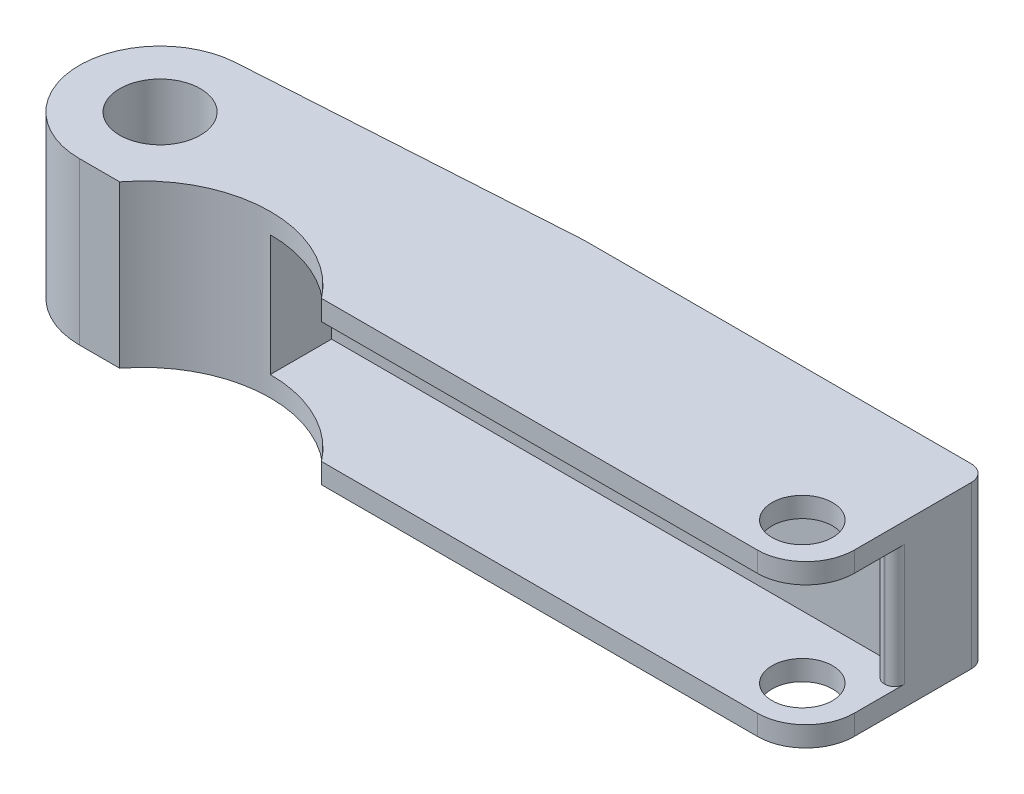
ISO-10303-21;
HEADER;
FILE_DESCRIPTION(('STEP AP214'),'2;1');
FILE_NAME('part.step','',(''),(''),'','','');
FILE_SCHEMA(('AUTOMOTIVE_DESIGN { 1 0 10303 214 1 1 1 1 }'));
ENDSEC;
DATA;
#1=APPLICATION_CONTEXT('core data for automotive mechanical design processes');
#2=APPLICATION_PROTOCOL_DEFINITION('international standard','automotive_design',2000,#1);
#3=PRODUCT_CONTEXT('',#1,'mechanical');
#4=PRODUCT('Part','Part','',(#3));
#5=PRODUCT_RELATED_PRODUCT_CATEGORY('part','',(#4));
#6=PRODUCT_DEFINITION_FORMATION('','',#4);
#7=PRODUCT_DEFINITION_CONTEXT('part definition',#1,'design');
#8=PRODUCT_DEFINITION('design','',#6,#7);
#9=PRODUCT_DEFINITION_SHAPE('','',#8);
#10=(LENGTH_UNIT() NAMED_UNIT(*) SI_UNIT(.MILLI.,.METRE.));
#11=(NAMED_UNIT(*) PLANE_ANGLE_UNIT() SI_UNIT($,.RADIAN.));
#12=(NAMED_UNIT(*) SI_UNIT($,.STERADIAN.) SOLID_ANGLE_UNIT());
#13=UNCERTAINTY_MEASURE_WITH_UNIT(LENGTH_MEASURE(1.E-05),#10,'distance_accuracy_value','');
#14=(GEOMETRIC_REPRESENTATION_CONTEXT(3) GLOBAL_UNCERTAINTY_ASSIGNED_CONTEXT((#13)) GLOBAL_UNIT_ASSIGNED_CONTEXT((#10,
#11,#12)) REPRESENTATION_CONTEXT('',''));
#15=CARTESIAN_POINT('',(0.,0.,0.));
#16=DIRECTION('',(0.,0.,1.));
#17=DIRECTION('',(1.,0.,0.));
#18=AXIS2_PLACEMENT_3D('',#15,#16,#17);
#19=CARTESIAN_POINT('',(127.,25.4,0.));
#20=DIRECTION('',(-1.,0.,0.));
#21=DIRECTION('',(0.,0.,1.));
#22=AXIS2_PLACEMENT_3D('',#19,#20,#21);
#23=PLANE('',#22);
#24=DIRECTION('',(0.,0.,-1.));
#25=VECTOR('',#24,1.);
#26=CARTESIAN_POINT('',(127.,0.,0.));
#27=LINE('',#26,#25);
#28=CARTESIAN_POINT('',(127.,0.,-7.62));
#29=VERTEX_POINT('',#28);
#30=CARTESIAN_POINT('',(127.,0.,-26.035));
#31=VERTEX_POINT('',#30);
#32=EDGE_CURVE('E261',#29,#31,#27,.T.);
#33=ORIENTED_EDGE('',*,*,#32,.T.);
#34=DIRECTION('',(0.,-1.,0.));
#35=VECTOR('',#34,1.);
#36=CARTESIAN_POINT('',(127.,25.4,-26.035));
#37=LINE('',#36,#35);
#38=CARTESIAN_POINT('',(127.,25.4,-26.035));
#39=VERTEX_POINT('',#38);
#40=EDGE_CURVE('E42',#31,#39,#37,.F.);
#41=ORIENTED_EDGE('',*,*,#40,.T.);
#42=DIRECTION('',(0.,0.,-1.));
#43=VECTOR('',#42,1.);
#44=CARTESIAN_POINT('',(127.,25.4,0.));
#45=LINE('',#44,#43);
#46=CARTESIAN_POINT('',(127.,25.4,-7.62));
#47=VERTEX_POINT('',#46);
#48=EDGE_CURVE('E323',#47,#39,#45,.T.);
#49=ORIENTED_EDGE('',*,*,#48,.F.);
#50=DIRECTION('',(0.,-1.,0.));
#51=VECTOR('',#50,1.);
#52=CARTESIAN_POINT('',(127.,25.4,-7.62));
#53=LINE('',#52,#51);
#54=CARTESIAN_POINT('',(127.,22.225,-7.62));
#55=VERTEX_POINT('',#54);
#56=EDGE_CURVE('E196',#47,#55,#53,.T.);
#57=ORIENTED_EDGE('',*,*,#56,.T.);
#58=DIRECTION('',(0.,0.,-1.));
#59=VECTOR('',#58,1.);
#60=CARTESIAN_POINT('',(127.,22.225,0.));
#61=LINE('',#60,#59);
#62=CARTESIAN_POINT('',(127.,22.225,-15.494));
#63=VERTEX_POINT('',#62);
#64=EDGE_CURVE('E192',#55,#63,#61,.T.);
#65=ORIENTED_EDGE('',*,*,#64,.T.);
#66=DIRECTION('',(0.,1.,0.));
#67=VECTOR('',#66,1.);
#68=CARTESIAN_POINT('',(127.,25.4,-15.494));
#69=LINE('',#68,#67);
#70=CARTESIAN_POINT('',(127.,3.175,-15.494));
#71=VERTEX_POINT('',#70);
#72=EDGE_CURVE('E189',#63,#71,#69,.F.);
#73=ORIENTED_EDGE('',*,*,#72,.T.);
#74=DIRECTION('',(0.,0.,-1.));
#75=VECTOR('',#74,1.);
#76=CARTESIAN_POINT('',(127.,3.175,0.));
#77=LINE('',#76,#75);
#78=CARTESIAN_POINT('',(127.,3.175,-7.62));
#79=VERTEX_POINT('',#78);
#80=EDGE_CURVE('E176',#79,#71,#77,.T.);
#81=ORIENTED_EDGE('',*,*,#80,.F.);
#82=EDGE_CURVE('E186',#79,#29,#53,.T.);
#83=ORIENTED_EDGE('',*,*,#82,.T.);
#84=EDGE_LOOP('',(#33,#41,#49,#57,#65,#73,#81,#83));
#85=FACE_BOUND('',#84,.T.);
#86=ADVANCED_FACE('F34',(#85),#23,.F.);
#87=CARTESIAN_POINT('',(119.38,25.4,-7.62));
#88=DIRECTION('',(0.,-1.,0.));
#89=DIRECTION('',(0.,0.,-1.));
#90=AXIS2_PLACEMENT_3D('',#87,#88,#89);
#91=CYLINDRICAL_SURFACE('',#90,7.62);
#92=CARTESIAN_POINT('',(119.38,22.225,-7.62));
#93=DIRECTION('',(0.,1.,0.));
#94=DIRECTION('',(-1.,0.,0.));
#95=AXIS2_PLACEMENT_3D('',#92,#93,#94);
#96=CIRCLE('',#95,7.62);
#97=CARTESIAN_POINT('',(119.38,22.225,0.));
#98=VERTEX_POINT('',#97);
#99=EDGE_CURVE('E183',#55,#98,#96,.F.);
#100=ORIENTED_EDGE('',*,*,#99,.F.);
#101=ORIENTED_EDGE('',*,*,#56,.F.);
#102=CARTESIAN_POINT('',(119.38,25.4,-7.62));
#103=DIRECTION('',(0.,-1.,0.));
#104=DIRECTION('',(0.,0.,-1.));
#105=AXIS2_PLACEMENT_3D('',#102,#103,#104);
#106=CIRCLE('',#105,7.62);
#107=CARTESIAN_POINT('',(119.38,25.4,0.));
#108=VERTEX_POINT('',#107);
#109=EDGE_CURVE('E209',#108,#47,#106,.F.);
#110=ORIENTED_EDGE('',*,*,#109,.F.);
#111=DIRECTION('',(0.,-1.,0.));
#112=VECTOR('',#111,1.);
#113=CARTESIAN_POINT('',(119.38,25.4,0.));
#114=LINE('',#113,#112);
#115=EDGE_CURVE('E205',#98,#108,#114,.F.);
#116=ORIENTED_EDGE('',*,*,#115,.F.);
#117=EDGE_LOOP('',(#100,#101,#110,#116));
#118=FACE_BOUND('',#117,.T.);
#119=ADVANCED_FACE('F335',(#118),#91,.T.);
#120=CARTESIAN_POINT('',(0.,25.4,0.));
#121=DIRECTION('',(0.,0.,-1.));
#122=DIRECTION('',(-1.,0.,0.));
#123=AXIS2_PLACEMENT_3D('',#120,#121,#122);
#124=PLANE('',#123);
#125=DIRECTION('',(1.,0.,0.));
#126=VECTOR('',#125,1.);
#127=CARTESIAN_POINT('',(0.,0.,0.));
#128=LINE('',#127,#126);
#129=CARTESIAN_POINT('',(50.8,0.,0.));
#130=VERTEX_POINT('',#129);
#131=CARTESIAN_POINT('',(119.38,0.,0.));
#132=VERTEX_POINT('',#131);
#133=EDGE_CURVE('E316',#130,#132,#128,.T.);
#134=ORIENTED_EDGE('',*,*,#133,.T.);
#135=DIRECTION('',(0.,-1.,0.));
#136=VECTOR('',#135,1.);
#137=CARTESIAN_POINT('',(119.38,25.4,0.));
#138=LINE('',#137,#136);
#139=CARTESIAN_POINT('',(119.38,3.175,0.));
#140=VERTEX_POINT('',#139);
#141=EDGE_CURVE('E184',#132,#140,#138,.F.);
#142=ORIENTED_EDGE('',*,*,#141,.T.);
#143=DIRECTION('',(1.,0.,0.));
#144=VECTOR('',#143,1.);
#145=CARTESIAN_POINT('',(123.825,3.175,0.));
#146=LINE('',#145,#144);
#147=CARTESIAN_POINT('',(50.8,3.17499999999999,0.));
#148=VERTEX_POINT('',#147);
#149=EDGE_CURVE('E179',#148,#140,#146,.T.);
#150=ORIENTED_EDGE('',*,*,#149,.F.);
#151=DIRECTION('',(0.,1.,0.));
#152=VECTOR('',#151,1.);
#153=CARTESIAN_POINT('',(50.8,-30.48,0.));
#154=LINE('',#153,#152);
#155=EDGE_CURVE('E307',#130,#148,#154,.T.);
#156=ORIENTED_EDGE('',*,*,#155,.F.);
#157=EDGE_LOOP('',(#134,#142,#150,#156));
#158=FACE_BOUND('',#157,.T.);
#159=ADVANCED_FACE('F327',(#158),#124,.F.);
#160=CARTESIAN_POINT('',(0.,25.4,0.));
#161=DIRECTION('',(0.,-1.,0.));
#162=DIRECTION('',(0.,0.,-1.));
#163=AXIS2_PLACEMENT_3D('',#160,#161,#162);
#164=PLANE('',#163);
#165=CARTESIAN_POINT('',(118.82060280476,25.4,-7.62));
#166=DIRECTION('',(0.,-1.,0.));
#167=DIRECTION('',(0.,0.,-1.));
#168=AXIS2_PLACEMENT_3D('',#165,#166,#167);
#169=CIRCLE('',#168,4.7625);
#170=CARTESIAN_POINT('',(118.82060280476,25.4,-12.3825));
#171=VERTEX_POINT('',#170);
#172=EDGE_CURVE('E353',#171,#171,#169,.T.);
#173=ORIENTED_EDGE('',*,*,#172,.T.);
#174=EDGE_LOOP('',(#173));
#175=FACE_BOUND('',#174,.T.);
#176=CARTESIAN_POINT('',(12.7,25.4,-12.7));
#177=DIRECTION('',(0.,1.,0.));
#178=DIRECTION('',(0.,0.,1.));
#179=AXIS2_PLACEMENT_3D('',#176,#177,#178);
#180=CIRCLE('',#179,6.35);
#181=CARTESIAN_POINT('',(12.7,25.4,-6.35));
#182=VERTEX_POINT('',#181);
#183=EDGE_CURVE('E285',#182,#182,#180,.T.);
#184=ORIENTED_EDGE('',*,*,#183,.F.);
#185=EDGE_LOOP('',(#184));
#186=FACE_BOUND('',#185,.T.);
#187=ORIENTED_EDGE('',*,*,#48,.T.);
#188=CARTESIAN_POINT('',(124.46,25.4,-26.035));
#189=DIRECTION('',(0.,-1.,0.));
#190=DIRECTION('',(0.,0.,-1.));
#191=AXIS2_PLACEMENT_3D('',#188,#189,#190);
#192=CIRCLE('',#191,2.54);
#193=CARTESIAN_POINT('',(124.46,25.4,-28.575));
#194=VERTEX_POINT('',#193);
#195=EDGE_CURVE('E12',#39,#194,#192,.F.);
#196=ORIENTED_EDGE('',*,*,#195,.T.);
#197=DIRECTION('',(-1.,0.,0.));
#198=VECTOR('',#197,1.);
#199=CARTESIAN_POINT('',(0.,25.4,-28.575));
#200=LINE('',#199,#198);
#201=CARTESIAN_POINT('',(63.5,25.4,-28.575));
#202=VERTEX_POINT('',#201);
#203=EDGE_CURVE('E253',#194,#202,#200,.T.);
#204=ORIENTED_EDGE('',*,*,#203,.T.);
#205=DIRECTION('',(-0.998082311521692,0.,0.0619007223505286));
#206=VECTOR('',#205,1.);
#207=CARTESIAN_POINT('',(-1.52210819493791,25.4,-24.5423511697803));
#208=LINE('',#207,#206);
#209=CARTESIAN_POINT('',(11.9138608261483,25.4,-25.3756453563255));
#210=VERTEX_POINT('',#209);
#211=EDGE_CURVE('E366',#202,#210,#208,.T.);
#212=ORIENTED_EDGE('',*,*,#211,.T.);
#213=CARTESIAN_POINT('',(12.7,25.4,-12.7));
#214=DIRECTION('',(0.,-1.,0.));
#215=DIRECTION('',(0.,0.,-1.));
#216=AXIS2_PLACEMENT_3D('',#213,#214,#215);
#217=CIRCLE('',#216,12.7);
#218=CARTESIAN_POINT('',(12.7,25.4,0.));
#219=VERTEX_POINT('',#218);
#220=EDGE_CURVE('E278',#210,#219,#217,.F.);
#221=ORIENTED_EDGE('',*,*,#220,.T.);
#222=DIRECTION('',(1.,0.,0.));
#223=VECTOR('',#222,1.);
#224=CARTESIAN_POINT('',(0.,25.4,0.));
#225=LINE('',#224,#223);
#226=CARTESIAN_POINT('',(19.05,25.4,0.));
#227=VERTEX_POINT('',#226);
#228=EDGE_CURVE('E264',#219,#227,#225,.T.);
#229=ORIENTED_EDGE('',*,*,#228,.T.);
#230=CARTESIAN_POINT('',(34.925,25.4,12.2117898343934));
#231=DIRECTION('',(0.,-1.,0.));
#232=DIRECTION('',(0.,0.,-1.));
#233=AXIS2_PLACEMENT_3D('',#230,#231,#232);
#234=CIRCLE('',#233,20.0285654992911);
#235=CARTESIAN_POINT('',(50.8,25.4,0.));
#236=VERTEX_POINT('',#235);
#237=EDGE_CURVE('E312',#236,#227,#234,.F.);
#238=ORIENTED_EDGE('',*,*,#237,.F.);
#239=EDGE_CURVE('E260',#236,#108,#225,.T.);
#240=ORIENTED_EDGE('',*,*,#239,.T.);
#241=ORIENTED_EDGE('',*,*,#109,.T.);
#242=EDGE_LOOP('',(#187,#196,#204,#212,#221,#229,#238,#240,#241));
#243=FACE_BOUND('',#242,.T.);
#244=ADVANCED_FACE('F329',(#175,#186,#243),#164,.F.);
#245=CARTESIAN_POINT('',(0.,0.,0.));
#246=DIRECTION('',(0.,-1.,0.));
#247=DIRECTION('',(0.,0.,-1.));
#248=AXIS2_PLACEMENT_3D('',#245,#246,#247);
#249=PLANE('',#248);
#250=CARTESIAN_POINT('',(118.82060280476,0.,-7.62));
#251=DIRECTION('',(0.,-1.,0.));
#252=DIRECTION('',(0.,0.,-1.));
#253=AXIS2_PLACEMENT_3D('',#250,#251,#252);
#254=CIRCLE('',#253,4.7625);
#255=CARTESIAN_POINT('',(118.82060280476,0.,-12.3825));
#256=VERTEX_POINT('',#255);
#257=EDGE_CURVE('E216',#256,#256,#254,.T.);
#258=ORIENTED_EDGE('',*,*,#257,.F.);
#259=EDGE_LOOP('',(#258));
#260=FACE_BOUND('',#259,.T.);
#261=CARTESIAN_POINT('',(12.7,0.,-12.7));
#262=DIRECTION('',(0.,-1.,0.));
#263=DIRECTION('',(0.,0.,-1.));
#264=AXIS2_PLACEMENT_3D('',#261,#262,#263);
#265=CIRCLE('',#264,6.35);
#266=CARTESIAN_POINT('',(12.7,0.,-19.05));
#267=VERTEX_POINT('',#266);
#268=EDGE_CURVE('E281',#267,#267,#265,.T.);
#269=ORIENTED_EDGE('',*,*,#268,.F.);
#270=EDGE_LOOP('',(#269));
#271=FACE_BOUND('',#270,.T.);
#272=DIRECTION('',(-1.,0.,0.));
#273=VECTOR('',#272,1.);
#274=CARTESIAN_POINT('',(0.,0.,-28.575));
#275=LINE('',#274,#273);
#276=CARTESIAN_POINT('',(124.46,0.,-28.575));
#277=VERTEX_POINT('',#276);
#278=CARTESIAN_POINT('',(63.5,0.,-28.575));
#279=VERTEX_POINT('',#278);
#280=EDGE_CURVE('E251',#277,#279,#275,.T.);
#281=ORIENTED_EDGE('',*,*,#280,.F.);
#282=CARTESIAN_POINT('',(124.46,0.,-26.035));
#283=DIRECTION('',(0.,-1.,0.));
#284=DIRECTION('',(0.,0.,-1.));
#285=AXIS2_PLACEMENT_3D('',#282,#283,#284);
#286=CIRCLE('',#285,2.54);
#287=EDGE_CURVE('E56',#277,#31,#286,.T.);
#288=ORIENTED_EDGE('',*,*,#287,.T.);
#289=ORIENTED_EDGE('',*,*,#32,.F.);
#290=CARTESIAN_POINT('',(119.38,0.,-7.62));
#291=DIRECTION('',(0.,-1.,0.));
#292=DIRECTION('',(0.,0.,-1.));
#293=AXIS2_PLACEMENT_3D('',#290,#291,#292);
#294=CIRCLE('',#293,7.62);
#295=EDGE_CURVE('E195',#29,#132,#294,.T.);
#296=ORIENTED_EDGE('',*,*,#295,.T.);
#297=ORIENTED_EDGE('',*,*,#133,.F.);
#298=CARTESIAN_POINT('',(34.925,0.,12.2117898343934));
#299=DIRECTION('',(0.,-1.,0.));
#300=DIRECTION('',(0.,0.,-1.));
#301=AXIS2_PLACEMENT_3D('',#298,#299,#300);
#302=CIRCLE('',#301,20.0285654992911);
#303=CARTESIAN_POINT('',(19.05,0.,0.));
#304=VERTEX_POINT('',#303);
#305=EDGE_CURVE('E270',#130,#304,#302,.F.);
#306=ORIENTED_EDGE('',*,*,#305,.T.);
#307=CARTESIAN_POINT('',(12.7,0.,0.));
#308=VERTEX_POINT('',#307);
#309=EDGE_CURVE('E266',#308,#304,#128,.T.);
#310=ORIENTED_EDGE('',*,*,#309,.F.);
#311=CARTESIAN_POINT('',(12.7,0.,-12.7));
#312=DIRECTION('',(0.,-1.,0.));
#313=DIRECTION('',(0.,0.,-1.));
#314=AXIS2_PLACEMENT_3D('',#311,#312,#313);
#315=CIRCLE('',#314,12.7);
#316=CARTESIAN_POINT('',(11.9138608261483,0.,-25.3756453563255));
#317=VERTEX_POINT('',#316);
#318=EDGE_CURVE('E276',#308,#317,#315,.T.);
#319=ORIENTED_EDGE('',*,*,#318,.T.);
#320=DIRECTION('',(0.998082311521692,0.,-0.0619007223505286));
#321=VECTOR('',#320,1.);
#322=CARTESIAN_POINT('',(-1.52210819493791,0.,-24.5423511697803));
#323=LINE('',#322,#321);
#324=EDGE_CURVE('E259',#317,#279,#323,.T.);
#325=ORIENTED_EDGE('',*,*,#324,.T.);
#326=EDGE_LOOP('',(#281,#288,#289,#296,#297,#306,#310,#319,#325));
#327=FACE_BOUND('',#326,.T.);
#328=ADVANCED_FACE('F257',(#260,#271,#327),#249,.T.);
#329=CARTESIAN_POINT('',(0.,25.4,-28.575));
#330=DIRECTION('',(0.,0.,1.));
#331=DIRECTION('',(1.,0.,0.));
#332=AXIS2_PLACEMENT_3D('',#329,#330,#331);
#333=PLANE('',#332);
#334=ORIENTED_EDGE('',*,*,#203,.F.);
#335=DIRECTION('',(0.,-1.,0.));
#336=VECTOR('',#335,1.);
#337=CARTESIAN_POINT('',(124.46,25.4,-28.575));
#338=LINE('',#337,#336);
#339=EDGE_CURVE('E243',#194,#277,#338,.T.);
#340=ORIENTED_EDGE('',*,*,#339,.T.);
#341=ORIENTED_EDGE('',*,*,#280,.T.);
#342=DIRECTION('',(0.,1.,0.));
#343=VECTOR('',#342,1.);
#344=CARTESIAN_POINT('',(63.5,-6.35,-28.575));
#345=LINE('',#344,#343);
#346=EDGE_CURVE('E373',#279,#202,#345,.T.);
#347=ORIENTED_EDGE('',*,*,#346,.T.);
#348=EDGE_LOOP('',(#334,#340,#341,#347));
#349=FACE_BOUND('',#348,.T.);
#350=ADVANCED_FACE('F249',(#349),#333,.F.);
#351=ORIENTED_EDGE('',*,*,#228,.F.);
#352=DIRECTION('',(0.,-1.,0.));
#353=VECTOR('',#352,1.);
#354=CARTESIAN_POINT('',(12.7,25.4,0.));
#355=LINE('',#354,#353);
#356=EDGE_CURVE('E273',#219,#308,#355,.T.);
#357=ORIENTED_EDGE('',*,*,#356,.T.);
#358=ORIENTED_EDGE('',*,*,#309,.T.);
#359=DIRECTION('',(0.,1.,0.));
#360=VECTOR('',#359,1.);
#361=CARTESIAN_POINT('',(19.05,-30.48,0.));
#362=LINE('',#361,#360);
#363=EDGE_CURVE('E284',#304,#227,#362,.T.);
#364=ORIENTED_EDGE('',*,*,#363,.T.);
#365=EDGE_LOOP('',(#351,#357,#358,#364));
#366=FACE_BOUND('',#365,.T.);
#367=ADVANCED_FACE('F392',(#366),#124,.F.);
#368=DIRECTION('',(-1.,0.,0.));
#369=VECTOR('',#368,1.);
#370=CARTESIAN_POINT('',(123.825,22.225,0.));
#371=LINE('',#370,#369);
#372=CARTESIAN_POINT('',(50.8,22.225,0.));
#373=VERTEX_POINT('',#372);
#374=EDGE_CURVE('E356',#98,#373,#371,.T.);
#375=ORIENTED_EDGE('',*,*,#374,.F.);
#376=ORIENTED_EDGE('',*,*,#115,.T.);
#377=ORIENTED_EDGE('',*,*,#239,.F.);
#378=EDGE_CURVE('E313',#373,#236,#154,.T.);
#379=ORIENTED_EDGE('',*,*,#378,.F.);
#380=EDGE_LOOP('',(#375,#376,#377,#379));
#381=FACE_BOUND('',#380,.T.);
#382=ADVANCED_FACE('F391',(#381),#124,.F.);
#383=CARTESIAN_POINT('',(34.925,-30.48,12.2117898343934));
#384=DIRECTION('',(0.,1.,0.));
#385=DIRECTION('',(0.,0.,1.));
#386=AXIS2_PLACEMENT_3D('',#383,#384,#385);
#387=CYLINDRICAL_SURFACE('',#386,20.0285654992911);
#388=CARTESIAN_POINT('',(34.925,3.17499999999998,12.2117898343934));
#389=DIRECTION('',(0.,-1.,0.));
#390=DIRECTION('',(1.,0.,0.));
#391=AXIS2_PLACEMENT_3D('',#388,#389,#390);
#392=CIRCLE('',#391,20.0285654992911);
#393=CARTESIAN_POINT('',(34.925,3.17499999999999,-7.81677566489769));
#394=VERTEX_POINT('',#393);
#395=EDGE_CURVE('E197',#394,#148,#392,.T.);
#396=ORIENTED_EDGE('',*,*,#395,.F.);
#397=DIRECTION('',(0.,1.,0.));
#398=VECTOR('',#397,1.);
#399=CARTESIAN_POINT('',(34.925,-30.48,-7.81677566489769));
#400=LINE('',#399,#398);
#401=CARTESIAN_POINT('',(34.925,22.225,-7.81677566489769));
#402=VERTEX_POINT('',#401);
#403=EDGE_CURVE('E200',#402,#394,#400,.F.);
#404=ORIENTED_EDGE('',*,*,#403,.F.);
#405=CARTESIAN_POINT('',(34.925,22.225,12.2117898343934));
#406=DIRECTION('',(0.,1.,0.));
#407=DIRECTION('',(-1.,0.,0.));
#408=AXIS2_PLACEMENT_3D('',#405,#406,#407);
#409=CIRCLE('',#408,20.0285654992911);
#410=EDGE_CURVE('E280',#373,#402,#409,.T.);
#411=ORIENTED_EDGE('',*,*,#410,.F.);
#412=ORIENTED_EDGE('',*,*,#378,.T.);
#413=ORIENTED_EDGE('',*,*,#237,.T.);
#414=ORIENTED_EDGE('',*,*,#363,.F.);
#415=ORIENTED_EDGE('',*,*,#305,.F.);
#416=ORIENTED_EDGE('',*,*,#155,.T.);
#417=EDGE_LOOP('',(#396,#404,#411,#412,#413,#414,#415,#416));
#418=FACE_BOUND('',#417,.T.);
#419=ADVANCED_FACE('F305',(#418),#387,.F.);
#420=CARTESIAN_POINT('',(12.7,25.4,-12.7));
#421=DIRECTION('',(0.,-1.,0.));
#422=DIRECTION('',(0.,0.,-1.));
#423=AXIS2_PLACEMENT_3D('',#420,#421,#422);
#424=CYLINDRICAL_SURFACE('',#423,12.7);
#425=ORIENTED_EDGE('',*,*,#220,.F.);
#426=DIRECTION('',(0.,1.,0.));
#427=VECTOR('',#426,1.);
#428=CARTESIAN_POINT('',(11.9138608261483,-6.35,-25.3756453563255));
#429=LINE('',#428,#427);
#430=EDGE_CURVE('E372',#317,#210,#429,.T.);
#431=ORIENTED_EDGE('',*,*,#430,.F.);
#432=ORIENTED_EDGE('',*,*,#318,.F.);
#433=ORIENTED_EDGE('',*,*,#356,.F.);
#434=EDGE_LOOP('',(#425,#431,#432,#433));
#435=FACE_BOUND('',#434,.T.);
#436=ADVANCED_FACE('F403',(#435),#424,.T.);
#437=CARTESIAN_POINT('',(12.7,-6.35,-12.7));
#438=DIRECTION('',(0.,1.,0.));
#439=DIRECTION('',(0.,0.,1.));
#440=AXIS2_PLACEMENT_3D('',#437,#438,#439);
#441=CYLINDRICAL_SURFACE('',#440,6.35);
#442=ORIENTED_EDGE('',*,*,#268,.T.);
#443=EDGE_LOOP('',(#442));
#444=FACE_BOUND('',#443,.T.);
#445=ORIENTED_EDGE('',*,*,#183,.T.);
#446=EDGE_LOOP('',(#445));
#447=FACE_BOUND('',#446,.T.);
#448=ADVANCED_FACE('F379',(#444,#447),#441,.F.);
#449=CARTESIAN_POINT('',(-1.52210819493791,-6.35,-24.5423511697803));
#450=DIRECTION('',(-0.0619007223505286,0.,-0.998082311521692));
#451=DIRECTION('',(-0.998082311521692,0.,0.0619007223505286));
#452=AXIS2_PLACEMENT_3D('',#449,#450,#451);
#453=PLANE('',#452);
#454=ORIENTED_EDGE('',*,*,#430,.T.);
#455=ORIENTED_EDGE('',*,*,#211,.F.);
#456=ORIENTED_EDGE('',*,*,#346,.F.);
#457=ORIENTED_EDGE('',*,*,#324,.F.);
#458=EDGE_LOOP('',(#454,#455,#456,#457));
#459=FACE_BOUND('',#458,.T.);
#460=ADVANCED_FACE('F436',(#459),#453,.T.);
#461=CARTESIAN_POINT('',(123.825,22.225,-17.4625));
#462=DIRECTION('',(1.,0.,0.));
#463=DIRECTION('',(0.,0.,-1.));
#464=AXIS2_PLACEMENT_3D('',#461,#462,#463);
#465=PLANE('',#464);
#466=DIRECTION('',(0.,0.,1.));
#467=VECTOR('',#466,1.);
#468=CARTESIAN_POINT('',(123.825,3.175,-17.4625));
#469=LINE('',#468,#467);
#470=CARTESIAN_POINT('',(123.825,3.175,-15.9385));
#471=VERTEX_POINT('',#470);
#472=CARTESIAN_POINT('',(123.825,3.175,-15.494));
#473=VERTEX_POINT('',#472);
#474=EDGE_CURVE('E302',#471,#473,#469,.T.);
#475=ORIENTED_EDGE('',*,*,#474,.T.);
#476=DIRECTION('',(0.,1.,0.));
#477=VECTOR('',#476,1.);
#478=CARTESIAN_POINT('',(123.825,22.225,-15.494));
#479=LINE('',#478,#477);
#480=CARTESIAN_POINT('',(123.825,22.225,-15.494));
#481=VERTEX_POINT('',#480);
#482=EDGE_CURVE('E224',#473,#481,#479,.T.);
#483=ORIENTED_EDGE('',*,*,#482,.T.);
#484=DIRECTION('',(0.,0.,1.));
#485=VECTOR('',#484,1.);
#486=CARTESIAN_POINT('',(123.825,22.225,-17.4625));
#487=LINE('',#486,#485);
#488=CARTESIAN_POINT('',(123.825,22.225,-15.9385));
#489=VERTEX_POINT('',#488);
#490=EDGE_CURVE('E362',#489,#481,#487,.T.);
#491=ORIENTED_EDGE('',*,*,#490,.F.);
#492=DIRECTION('',(0.,1.,0.));
#493=VECTOR('',#492,1.);
#494=CARTESIAN_POINT('',(123.825,3.175,-15.9385));
#495=LINE('',#494,#493);
#496=EDGE_CURVE('E222',#489,#471,#495,.F.);
#497=ORIENTED_EDGE('',*,*,#496,.T.);
#498=EDGE_LOOP('',(#475,#483,#491,#497));
#499=FACE_BOUND('',#498,.T.);
#500=ADVANCED_FACE('F438',(#499),#465,.F.);
#501=CARTESIAN_POINT('',(123.825,3.175,-17.4625));
#502=DIRECTION('',(0.,-1.,0.));
#503=DIRECTION('',(1.,0.,0.));
#504=AXIS2_PLACEMENT_3D('',#501,#502,#503);
#505=PLANE('',#504);
#506=ORIENTED_EDGE('',*,*,#474,.F.);
#507=CARTESIAN_POINT('',(122.301,3.175,-15.9385));
#508=DIRECTION('',(0.,-1.,0.));
#509=DIRECTION('',(1.,0.,0.));
#510=AXIS2_PLACEMENT_3D('',#507,#508,#509);
#511=CIRCLE('',#510,1.524);
#512=CARTESIAN_POINT('',(122.301,3.175,-17.4625));
#513=VERTEX_POINT('',#512);
#514=EDGE_CURVE('E232',#471,#513,#511,.F.);
#515=ORIENTED_EDGE('',*,*,#514,.T.);
#516=DIRECTION('',(1.,0.,0.));
#517=VECTOR('',#516,1.);
#518=CARTESIAN_POINT('',(123.825,3.175,-17.4625));
#519=LINE('',#518,#517);
#520=CARTESIAN_POINT('',(34.925,3.17499999999999,-17.4625));
#521=VERTEX_POINT('',#520);
#522=EDGE_CURVE('E301',#521,#513,#519,.T.);
#523=ORIENTED_EDGE('',*,*,#522,.F.);
#524=DIRECTION('',(0.,0.,1.));
#525=VECTOR('',#524,1.);
#526=CARTESIAN_POINT('',(34.925,3.17499999999999,-17.4625));
#527=LINE('',#526,#525);
#528=EDGE_CURVE('E292',#521,#394,#527,.T.);
#529=ORIENTED_EDGE('',*,*,#528,.T.);
#530=ORIENTED_EDGE('',*,*,#395,.T.);
#531=ORIENTED_EDGE('',*,*,#149,.T.);
#532=CARTESIAN_POINT('',(119.38,3.175,-7.62));
#533=DIRECTION('',(0.,-1.,0.));
#534=DIRECTION('',(1.,0.,0.));
#535=AXIS2_PLACEMENT_3D('',#532,#533,#534);
#536=CIRCLE('',#535,7.62);
#537=EDGE_CURVE('E171',#140,#79,#536,.F.);
#538=ORIENTED_EDGE('',*,*,#537,.T.);
#539=ORIENTED_EDGE('',*,*,#80,.T.);
#540=CARTESIAN_POINT('',(125.476,3.175,-15.494));
#541=DIRECTION('',(0.,-1.,0.));
#542=DIRECTION('',(1.,0.,0.));
#543=AXIS2_PLACEMENT_3D('',#540,#541,#542);
#544=CIRCLE('',#543,1.524);
#545=CARTESIAN_POINT('',(125.476,3.175,-13.97));
#546=VERTEX_POINT('',#545);
#547=EDGE_CURVE('E237',#71,#546,#544,.T.);
#548=ORIENTED_EDGE('',*,*,#547,.T.);
#549=DIRECTION('',(1.,0.,0.));
#550=VECTOR('',#549,1.);
#551=CARTESIAN_POINT('',(118.9355,3.175,-13.97));
#552=LINE('',#551,#550);
#553=CARTESIAN_POINT('',(125.349,3.175,-13.97));
#554=VERTEX_POINT('',#553);
#555=EDGE_CURVE('E191',#554,#546,#552,.T.);
#556=ORIENTED_EDGE('',*,*,#555,.F.);
#557=CARTESIAN_POINT('',(125.349,3.175,-15.494));
#558=DIRECTION('',(0.,-1.,0.));
#559=DIRECTION('',(1.,0.,0.));
#560=AXIS2_PLACEMENT_3D('',#557,#558,#559);
#561=CIRCLE('',#560,1.524);
#562=EDGE_CURVE('E241',#554,#473,#561,.T.);
#563=ORIENTED_EDGE('',*,*,#562,.T.);
#564=EDGE_LOOP('',(#506,#515,#523,#529,#530,#531,#538,#539,#548,#556,#563));
#565=FACE_BOUND('',#564,.T.);
#566=CARTESIAN_POINT('',(118.82060280476,3.175,-7.62));
#567=DIRECTION('',(0.,-1.,0.));
#568=DIRECTION('',(1.,0.,0.));
#569=AXIS2_PLACEMENT_3D('',#566,#567,#568);
#570=CIRCLE('',#569,4.7625);
#571=CARTESIAN_POINT('',(123.58310280476,3.175,-7.62));
#572=VERTEX_POINT('',#571);
#573=EDGE_CURVE('E215',#572,#572,#570,.T.);
#574=ORIENTED_EDGE('',*,*,#573,.T.);
#575=EDGE_LOOP('',(#574));
#576=FACE_BOUND('',#575,.T.);
#577=ADVANCED_FACE('F174',(#565,#576),#505,.F.);
#578=CARTESIAN_POINT('',(34.925,22.225,-17.4625));
#579=DIRECTION('',(-1.,0.,0.));
#580=DIRECTION('',(0.,0.,1.));
#581=AXIS2_PLACEMENT_3D('',#578,#579,#580);
#582=PLANE('',#581);
#583=ORIENTED_EDGE('',*,*,#403,.T.);
#584=ORIENTED_EDGE('',*,*,#528,.F.);
#585=DIRECTION('',(0.,-1.,0.));
#586=VECTOR('',#585,1.);
#587=CARTESIAN_POINT('',(34.925,22.225,-17.4625));
#588=LINE('',#587,#586);
#589=CARTESIAN_POINT('',(34.925,22.225,-17.4625));
#590=VERTEX_POINT('',#589);
#591=EDGE_CURVE('E359',#590,#521,#588,.T.);
#592=ORIENTED_EDGE('',*,*,#591,.F.);
#593=DIRECTION('',(0.,0.,1.));
#594=VECTOR('',#593,1.);
#595=CARTESIAN_POINT('',(34.925,22.225,-17.4625));
#596=LINE('',#595,#594);
#597=EDGE_CURVE('E295',#590,#402,#596,.T.);
#598=ORIENTED_EDGE('',*,*,#597,.T.);
#599=EDGE_LOOP('',(#583,#584,#592,#598));
#600=FACE_BOUND('',#599,.T.);
#601=ADVANCED_FACE('F290',(#600),#582,.F.);
#602=CARTESIAN_POINT('',(123.825,22.225,-17.4625));
#603=DIRECTION('',(0.,1.,0.));
#604=DIRECTION('',(-1.,0.,0.));
#605=AXIS2_PLACEMENT_3D('',#602,#603,#604);
#606=PLANE('',#605);
#607=CARTESIAN_POINT('',(118.82060280476,22.225,-7.62));
#608=DIRECTION('',(0.,1.,0.));
#609=DIRECTION('',(-1.,0.,0.));
#610=AXIS2_PLACEMENT_3D('',#607,#608,#609);
#611=CIRCLE('',#610,4.7625);
#612=CARTESIAN_POINT('',(114.05810280476,22.225,-7.62));
#613=VERTEX_POINT('',#612);
#614=EDGE_CURVE('E212',#613,#613,#611,.T.);
#615=ORIENTED_EDGE('',*,*,#614,.T.);
#616=EDGE_LOOP('',(#615));
#617=FACE_BOUND('',#616,.T.);
#618=DIRECTION('',(-1.,0.,0.));
#619=VECTOR('',#618,1.);
#620=CARTESIAN_POINT('',(123.825,22.225,-17.4625));
#621=LINE('',#620,#619);
#622=CARTESIAN_POINT('',(122.301,22.225,-17.4625));
#623=VERTEX_POINT('',#622);
#624=EDGE_CURVE('E357',#623,#590,#621,.T.);
#625=ORIENTED_EDGE('',*,*,#624,.F.);
#626=CARTESIAN_POINT('',(122.301,22.225,-15.9385));
#627=DIRECTION('',(0.,1.,0.));
#628=DIRECTION('',(-1.,0.,0.));
#629=AXIS2_PLACEMENT_3D('',#626,#627,#628);
#630=CIRCLE('',#629,1.524);
#631=EDGE_CURVE('E230',#623,#489,#630,.F.);
#632=ORIENTED_EDGE('',*,*,#631,.T.);
#633=ORIENTED_EDGE('',*,*,#490,.T.);
#634=CARTESIAN_POINT('',(125.349,22.225,-15.494));
#635=DIRECTION('',(0.,1.,0.));
#636=DIRECTION('',(-1.,0.,0.));
#637=AXIS2_PLACEMENT_3D('',#634,#635,#636);
#638=CIRCLE('',#637,1.524);
#639=CARTESIAN_POINT('',(125.349,22.225,-13.97));
#640=VERTEX_POINT('',#639);
#641=EDGE_CURVE('E239',#481,#640,#638,.T.);
#642=ORIENTED_EDGE('',*,*,#641,.T.);
#643=DIRECTION('',(1.,0.,0.));
#644=VECTOR('',#643,1.);
#645=CARTESIAN_POINT('',(118.9355,22.225,-13.97));
#646=LINE('',#645,#644);
#647=CARTESIAN_POINT('',(125.476,22.225,-13.97));
#648=VERTEX_POINT('',#647);
#649=EDGE_CURVE('E345',#640,#648,#646,.T.);
#650=ORIENTED_EDGE('',*,*,#649,.T.);
#651=CARTESIAN_POINT('',(125.476,22.225,-15.494));
#652=DIRECTION('',(0.,1.,0.));
#653=DIRECTION('',(-1.,0.,0.));
#654=AXIS2_PLACEMENT_3D('',#651,#652,#653);
#655=CIRCLE('',#654,1.524);
#656=EDGE_CURVE('E234',#648,#63,#655,.T.);
#657=ORIENTED_EDGE('',*,*,#656,.T.);
#658=ORIENTED_EDGE('',*,*,#64,.F.);
#659=ORIENTED_EDGE('',*,*,#99,.T.);
#660=ORIENTED_EDGE('',*,*,#374,.T.);
#661=ORIENTED_EDGE('',*,*,#410,.T.);
#662=ORIENTED_EDGE('',*,*,#597,.F.);
#663=EDGE_LOOP('',(#625,#632,#633,#642,#650,#657,#658,#659,#660,#661,#662));
#664=FACE_BOUND('',#663,.T.);
#665=ADVANCED_FACE('F341',(#617,#664),#606,.F.);
#666=CARTESIAN_POINT('',(0.,0.,-17.4625));
#667=DIRECTION('',(0.,0.,-1.));
#668=DIRECTION('',(-1.,0.,0.));
#669=AXIS2_PLACEMENT_3D('',#666,#667,#668);
#670=PLANE('',#669);
#671=ORIENTED_EDGE('',*,*,#522,.T.);
#672=DIRECTION('',(0.,1.,0.));
#673=VECTOR('',#672,1.);
#674=CARTESIAN_POINT('',(122.301,22.225,-17.4625));
#675=LINE('',#674,#673);
#676=EDGE_CURVE('E227',#513,#623,#675,.T.);
#677=ORIENTED_EDGE('',*,*,#676,.T.);
#678=ORIENTED_EDGE('',*,*,#624,.T.);
#679=ORIENTED_EDGE('',*,*,#591,.T.);
#680=EDGE_LOOP('',(#671,#677,#678,#679));
#681=FACE_BOUND('',#680,.T.);
#682=ADVANCED_FACE('F409',(#681),#670,.F.);
#683=ORIENTED_EDGE('',*,*,#82,.F.);
#684=ORIENTED_EDGE('',*,*,#537,.F.);
#685=ORIENTED_EDGE('',*,*,#141,.F.);
#686=ORIENTED_EDGE('',*,*,#295,.F.);
#687=EDGE_LOOP('',(#683,#684,#685,#686));
#688=FACE_BOUND('',#687,.T.);
#689=ADVANCED_FACE('F194',(#688),#91,.T.);
#690=CARTESIAN_POINT('',(118.82060280476,42.8625,-7.62));
#691=DIRECTION('',(0.,-1.,0.));
#692=DIRECTION('',(0.,0.,-1.));
#693=AXIS2_PLACEMENT_3D('',#690,#691,#692);
#694=CYLINDRICAL_SURFACE('',#693,4.7625);
#695=ORIENTED_EDGE('',*,*,#614,.F.);
#696=EDGE_LOOP('',(#695));
#697=FACE_BOUND('',#696,.T.);
#698=ORIENTED_EDGE('',*,*,#172,.F.);
#699=EDGE_LOOP('',(#698));
#700=FACE_BOUND('',#699,.T.);
#701=ADVANCED_FACE('F408',(#697,#700),#694,.F.);
#702=ORIENTED_EDGE('',*,*,#257,.T.);
#703=EDGE_LOOP('',(#702));
#704=FACE_BOUND('',#703,.T.);
#705=ORIENTED_EDGE('',*,*,#573,.F.);
#706=EDGE_LOOP('',(#705));
#707=FACE_BOUND('',#706,.T.);
#708=ADVANCED_FACE('F509',(#704,#707),#694,.F.);
#709=CARTESIAN_POINT('',(118.9355,0.,-13.97));
#710=DIRECTION('',(0.,0.,-1.));
#711=DIRECTION('',(-1.,0.,0.));
#712=AXIS2_PLACEMENT_3D('',#709,#710,#711);
#713=PLANE('',#712);
#714=ORIENTED_EDGE('',*,*,#555,.T.);
#715=DIRECTION('',(0.,1.,0.));
#716=VECTOR('',#715,1.);
#717=CARTESIAN_POINT('',(125.476,0.,-13.97));
#718=LINE('',#717,#716);
#719=EDGE_CURVE('E218',#546,#648,#718,.T.);
#720=ORIENTED_EDGE('',*,*,#719,.T.);
#721=ORIENTED_EDGE('',*,*,#649,.F.);
#722=DIRECTION('',(0.,1.,0.));
#723=VECTOR('',#722,1.);
#724=CARTESIAN_POINT('',(125.349,0.,-13.97));
#725=LINE('',#724,#723);
#726=EDGE_CURVE('E211',#640,#554,#725,.F.);
#727=ORIENTED_EDGE('',*,*,#726,.T.);
#728=EDGE_LOOP('',(#714,#720,#721,#727));
#729=FACE_BOUND('',#728,.T.);
#730=ADVANCED_FACE('F414',(#729),#713,.F.);
#731=CARTESIAN_POINT('',(125.476,0.,-15.494));
#732=DIRECTION('',(0.,1.,0.));
#733=DIRECTION('',(0.,0.,1.));
#734=AXIS2_PLACEMENT_3D('',#731,#732,#733);
#735=CYLINDRICAL_SURFACE('',#734,1.524);
#736=ORIENTED_EDGE('',*,*,#547,.F.);
#737=ORIENTED_EDGE('',*,*,#72,.F.);
#738=ORIENTED_EDGE('',*,*,#656,.F.);
#739=ORIENTED_EDGE('',*,*,#719,.F.);
#740=EDGE_LOOP('',(#736,#737,#738,#739));
#741=FACE_BOUND('',#740,.T.);
#742=ADVANCED_FACE('F410',(#741),#735,.T.);
#743=CARTESIAN_POINT('',(125.349,22.225,-15.494));
#744=DIRECTION('',(0.,1.,0.));
#745=DIRECTION('',(0.,0.,1.));
#746=AXIS2_PLACEMENT_3D('',#743,#744,#745);
#747=CYLINDRICAL_SURFACE('',#746,1.524);
#748=ORIENTED_EDGE('',*,*,#562,.F.);
#749=ORIENTED_EDGE('',*,*,#726,.F.);
#750=ORIENTED_EDGE('',*,*,#641,.F.);
#751=ORIENTED_EDGE('',*,*,#482,.F.);
#752=EDGE_LOOP('',(#748,#749,#750,#751));
#753=FACE_BOUND('',#752,.T.);
#754=ADVANCED_FACE('F413',(#753),#747,.T.);
#755=CARTESIAN_POINT('',(122.301,0.,-15.9385));
#756=DIRECTION('',(0.,-1.,0.));
#757=DIRECTION('',(0.,0.,-1.));
#758=AXIS2_PLACEMENT_3D('',#755,#756,#757);
#759=CYLINDRICAL_SURFACE('',#758,1.524);
#760=ORIENTED_EDGE('',*,*,#514,.F.);
#761=ORIENTED_EDGE('',*,*,#496,.F.);
#762=ORIENTED_EDGE('',*,*,#631,.F.);
#763=ORIENTED_EDGE('',*,*,#676,.F.);
#764=EDGE_LOOP('',(#760,#761,#762,#763));
#765=FACE_BOUND('',#764,.T.);
#766=ADVANCED_FACE('F417',(#765),#759,.F.);
#767=CARTESIAN_POINT('',(124.46,25.4,-26.035));
#768=DIRECTION('',(0.,-1.,0.));
#769=DIRECTION('',(0.,0.,-1.));
#770=AXIS2_PLACEMENT_3D('',#767,#768,#769);
#771=CYLINDRICAL_SURFACE('',#770,2.54);
#772=ORIENTED_EDGE('',*,*,#195,.F.);
#773=ORIENTED_EDGE('',*,*,#40,.F.);
#774=ORIENTED_EDGE('',*,*,#287,.F.);
#775=ORIENTED_EDGE('',*,*,#339,.F.);
#776=EDGE_LOOP('',(#772,#773,#774,#775));
#777=FACE_BOUND('',#776,.T.);
#778=ADVANCED_FACE('F36',(#777),#771,.T.);
#779=CLOSED_SHELL('',(#86,#119,#159,#244,#328,#350,#367,#382,#419,#436,#448,#460,#500,#577,#601,
#665,#682,#689,#701,#708,#730,#742,#754,#766,#778));
#780=MANIFOLD_SOLID_BREP('B2',#779);
#781=ADVANCED_BREP_SHAPE_REPRESENTATION('',(#18,#780),#14);
#782=SHAPE_DEFINITION_REPRESENTATION(#9,#781);
ENDSEC;
END-ISO-10303-21;
